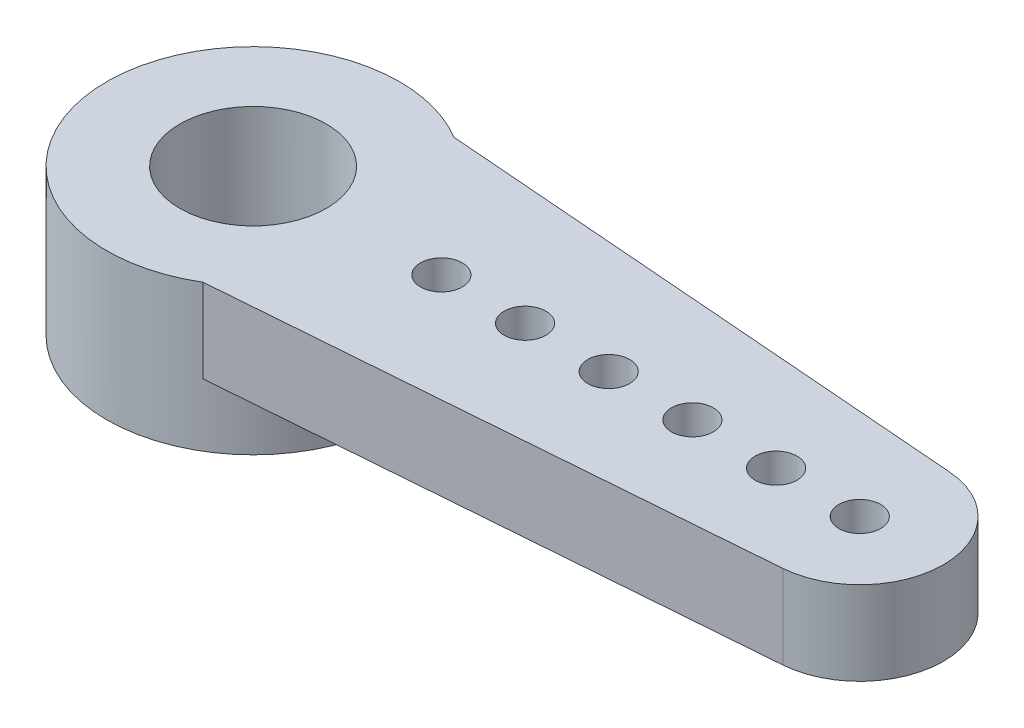
ISO-10303-21;
HEADER;
FILE_DESCRIPTION(('STEP AP214'),'2;1');
FILE_NAME('part.step','',(''),(''),'','','');
FILE_SCHEMA(('AUTOMOTIVE_DESIGN { 1 0 10303 214 1 1 1 1 }'));
ENDSEC;
DATA;
#1=APPLICATION_CONTEXT('core data for automotive mechanical design processes');
#2=APPLICATION_PROTOCOL_DEFINITION('international standard','automotive_design',2000,#1);
#3=PRODUCT_CONTEXT('',#1,'mechanical');
#4=PRODUCT('Part','Part','',(#3));
#5=PRODUCT_RELATED_PRODUCT_CATEGORY('part','',(#4));
#6=PRODUCT_DEFINITION_FORMATION('','',#4);
#7=PRODUCT_DEFINITION_CONTEXT('part definition',#1,'design');
#8=PRODUCT_DEFINITION('design','',#6,#7);
#9=PRODUCT_DEFINITION_SHAPE('','',#8);
#10=(LENGTH_UNIT() NAMED_UNIT(*) SI_UNIT(.MILLI.,.METRE.));
#11=(NAMED_UNIT(*) PLANE_ANGLE_UNIT() SI_UNIT($,.RADIAN.));
#12=(NAMED_UNIT(*) SI_UNIT($,.STERADIAN.) SOLID_ANGLE_UNIT());
#13=UNCERTAINTY_MEASURE_WITH_UNIT(LENGTH_MEASURE(1.E-05),#10,'distance_accuracy_value','');
#14=(GEOMETRIC_REPRESENTATION_CONTEXT(3) GLOBAL_UNCERTAINTY_ASSIGNED_CONTEXT((#13)) GLOBAL_UNIT_ASSIGNED_CONTEXT((#10,
#11,#12)) REPRESENTATION_CONTEXT('',''));
#15=CARTESIAN_POINT('',(0.,0.,0.));
#16=DIRECTION('',(0.,0.,1.));
#17=DIRECTION('',(1.,0.,0.));
#18=AXIS2_PLACEMENT_3D('',#15,#16,#17);
#19=CARTESIAN_POINT('',(0.,0.,0.));
#20=DIRECTION('',(0.,1.,0.));
#21=DIRECTION('',(0.,0.,1.));
#22=AXIS2_PLACEMENT_3D('',#19,#20,#21);
#23=PLANE('',#22);
#24=CARTESIAN_POINT('',(4.5,0.,0.));
#25=DIRECTION('',(0.,1.,0.));
#26=DIRECTION('',(0.,0.,1.));
#27=AXIS2_PLACEMENT_3D('',#24,#25,#26);
#28=CIRCLE('',#27,0.5);
#29=CARTESIAN_POINT('',(4.5,0.,0.5));
#30=VERTEX_POINT('',#29);
#31=EDGE_CURVE('E118',#30,#30,#28,.T.);
#32=ORIENTED_EDGE('',*,*,#31,.T.);
#33=EDGE_LOOP('',(#32));
#34=FACE_BOUND('',#33,.T.);
#35=CARTESIAN_POINT('',(6.5,0.,0.));
#36=DIRECTION('',(0.,1.,0.));
#37=DIRECTION('',(0.,0.,1.));
#38=AXIS2_PLACEMENT_3D('',#35,#36,#37);
#39=CIRCLE('',#38,0.5);
#40=CARTESIAN_POINT('',(6.5,0.,0.5));
#41=VERTEX_POINT('',#40);
#42=EDGE_CURVE('E121',#41,#41,#39,.T.);
#43=ORIENTED_EDGE('',*,*,#42,.T.);
#44=EDGE_LOOP('',(#43));
#45=FACE_BOUND('',#44,.T.);
#46=CARTESIAN_POINT('',(8.5,0.,0.));
#47=DIRECTION('',(0.,1.,0.));
#48=DIRECTION('',(0.,0.,1.));
#49=AXIS2_PLACEMENT_3D('',#46,#47,#48);
#50=CIRCLE('',#49,0.499999999999999);
#51=CARTESIAN_POINT('',(8.5,0.,0.499999999999999));
#52=VERTEX_POINT('',#51);
#53=EDGE_CURVE('E124',#52,#52,#50,.T.);
#54=ORIENTED_EDGE('',*,*,#53,.T.);
#55=EDGE_LOOP('',(#54));
#56=FACE_BOUND('',#55,.T.);
#57=CARTESIAN_POINT('',(10.5,0.,0.));
#58=DIRECTION('',(0.,1.,0.));
#59=DIRECTION('',(0.,0.,1.));
#60=AXIS2_PLACEMENT_3D('',#57,#58,#59);
#61=CIRCLE('',#60,0.500000000000001);
#62=CARTESIAN_POINT('',(10.5,0.,0.500000000000001));
#63=VERTEX_POINT('',#62);
#64=EDGE_CURVE('E127',#63,#63,#61,.T.);
#65=ORIENTED_EDGE('',*,*,#64,.T.);
#66=EDGE_LOOP('',(#65));
#67=FACE_BOUND('',#66,.T.);
#68=CARTESIAN_POINT('',(12.5,0.,0.));
#69=DIRECTION('',(0.,1.,0.));
#70=DIRECTION('',(0.,0.,1.));
#71=AXIS2_PLACEMENT_3D('',#68,#69,#70);
#72=CIRCLE('',#71,0.499999999999999);
#73=CARTESIAN_POINT('',(12.5,0.,0.499999999999999));
#74=VERTEX_POINT('',#73);
#75=EDGE_CURVE('E130',#74,#74,#72,.T.);
#76=ORIENTED_EDGE('',*,*,#75,.T.);
#77=EDGE_LOOP('',(#76));
#78=FACE_BOUND('',#77,.T.);
#79=CARTESIAN_POINT('',(14.5,0.,0.));
#80=DIRECTION('',(0.,1.,0.));
#81=DIRECTION('',(0.,0.,1.));
#82=AXIS2_PLACEMENT_3D('',#79,#80,#81);
#83=CIRCLE('',#82,0.500000000000001);
#84=CARTESIAN_POINT('',(14.5,0.,0.500000000000001));
#85=VERTEX_POINT('',#84);
#86=EDGE_CURVE('E133',#85,#85,#83,.T.);
#87=ORIENTED_EDGE('',*,*,#86,.T.);
#88=EDGE_LOOP('',(#87));
#89=FACE_BOUND('',#88,.T.);
#90=CARTESIAN_POINT('',(0.,0.,0.));
#91=DIRECTION('',(0.,-1.,0.));
#92=DIRECTION('',(0.,0.,-1.));
#93=AXIS2_PLACEMENT_3D('',#90,#91,#92);
#94=CIRCLE('',#93,3.5);
#95=CARTESIAN_POINT('',(1.802775637732,0.,-3.));
#96=VERTEX_POINT('',#95);
#97=CARTESIAN_POINT('',(1.802775637732,0.,3.));
#98=VERTEX_POINT('',#97);
#99=EDGE_CURVE('E84',#96,#98,#94,.T.);
#100=ORIENTED_EDGE('',*,*,#99,.F.);
#101=DIRECTION('',(-0.996950475022503,0.,-0.0780368525275488));
#102=VECTOR('',#101,1.);
#103=CARTESIAN_POINT('',(1.802775637732,0.,-3.));
#104=LINE('',#103,#102);
#105=CARTESIAN_POINT('',(14.6560737050551,0.,-1.993900950045));
#106=VERTEX_POINT('',#105);
#107=EDGE_CURVE('E86',#106,#96,#104,.T.);
#108=ORIENTED_EDGE('',*,*,#107,.F.);
#109=CARTESIAN_POINT('',(14.5,0.,0.));
#110=DIRECTION('',(0.,1.,0.));
#111=DIRECTION('',(0.,0.,1.));
#112=AXIS2_PLACEMENT_3D('',#109,#110,#111);
#113=CIRCLE('',#112,2.);
#114=CARTESIAN_POINT('',(14.6560737050551,0.,1.993900950045));
#115=VERTEX_POINT('',#114);
#116=EDGE_CURVE('E74',#115,#106,#113,.T.);
#117=ORIENTED_EDGE('',*,*,#116,.F.);
#118=DIRECTION('',(0.996950475022503,0.,-0.0780368525275488));
#119=VECTOR('',#118,1.);
#120=CARTESIAN_POINT('',(1.802775637732,0.,3.));
#121=LINE('',#120,#119);
#122=EDGE_CURVE('E67',#98,#115,#121,.T.);
#123=ORIENTED_EDGE('',*,*,#122,.F.);
#124=EDGE_LOOP('',(#100,#108,#117,#123));
#125=FACE_BOUND('',#124,.T.);
#126=ADVANCED_FACE('F35',(#34,#45,#56,#67,#78,#89,#125),#23,.F.);
#127=CARTESIAN_POINT('',(0.,2.,0.));
#128=DIRECTION('',(0.,-1.,0.));
#129=DIRECTION('',(0.,0.,-1.));
#130=AXIS2_PLACEMENT_3D('',#127,#128,#129);
#131=CYLINDRICAL_SURFACE('',#130,3.5);
#132=DIRECTION('',(0.,-1.,0.));
#133=VECTOR('',#132,1.);
#134=CARTESIAN_POINT('',(1.802775637732,2.,-3.));
#135=LINE('',#134,#133);
#136=CARTESIAN_POINT('',(1.802775637732,2.,-3.));
#137=VERTEX_POINT('',#136);
#138=EDGE_CURVE('E94',#137,#96,#135,.T.);
#139=ORIENTED_EDGE('',*,*,#138,.T.);
#140=ORIENTED_EDGE('',*,*,#99,.T.);
#141=DIRECTION('',(0.,-1.,0.));
#142=VECTOR('',#141,1.);
#143=CARTESIAN_POINT('',(1.802775637732,2.,3.));
#144=LINE('',#143,#142);
#145=CARTESIAN_POINT('',(1.802775637732,2.,3.));
#146=VERTEX_POINT('',#145);
#147=EDGE_CURVE('E11',#146,#98,#144,.T.);
#148=ORIENTED_EDGE('',*,*,#147,.F.);
#149=CARTESIAN_POINT('',(0.,2.,0.));
#150=DIRECTION('',(0.,1.,0.));
#151=DIRECTION('',(0.,0.,1.));
#152=AXIS2_PLACEMENT_3D('',#149,#150,#151);
#153=CIRCLE('',#152,3.5);
#154=EDGE_CURVE('E97',#137,#146,#153,.T.);
#155=ORIENTED_EDGE('',*,*,#154,.F.);
#156=EDGE_LOOP('',(#139,#140,#148,#155));
#157=FACE_BOUND('',#156,.T.);
#158=CARTESIAN_POINT('',(0.,-1.5,0.));
#159=DIRECTION('',(0.,-1.,0.));
#160=DIRECTION('',(0.,0.,-1.));
#161=AXIS2_PLACEMENT_3D('',#158,#159,#160);
#162=CIRCLE('',#161,3.5);
#163=CARTESIAN_POINT('',(0.,-1.5,-3.5));
#164=VERTEX_POINT('',#163);
#165=EDGE_CURVE('E90',#164,#164,#162,.T.);
#166=ORIENTED_EDGE('',*,*,#165,.F.);
#167=EDGE_LOOP('',(#166));
#168=FACE_BOUND('',#167,.T.);
#169=ADVANCED_FACE('F37',(#157,#168),#131,.T.);
#170=CARTESIAN_POINT('',(1.802775637732,2.,3.));
#171=DIRECTION('',(-0.0780368525275488,0.,-0.996950475022503));
#172=DIRECTION('',(-0.996950475022503,0.,0.0780368525275488));
#173=AXIS2_PLACEMENT_3D('',#170,#171,#172);
#174=PLANE('',#173);
#175=ORIENTED_EDGE('',*,*,#122,.T.);
#176=DIRECTION('',(0.,-1.,0.));
#177=VECTOR('',#176,1.);
#178=CARTESIAN_POINT('',(14.6560737050551,2.,1.993900950045));
#179=LINE('',#178,#177);
#180=CARTESIAN_POINT('',(14.6560737050551,2.,1.993900950045));
#181=VERTEX_POINT('',#180);
#182=EDGE_CURVE('E45',#181,#115,#179,.T.);
#183=ORIENTED_EDGE('',*,*,#182,.F.);
#184=DIRECTION('',(0.996950475022503,0.,-0.0780368525275488));
#185=VECTOR('',#184,1.);
#186=CARTESIAN_POINT('',(1.802775637732,2.,3.));
#187=LINE('',#186,#185);
#188=EDGE_CURVE('E79',#146,#181,#187,.T.);
#189=ORIENTED_EDGE('',*,*,#188,.F.);
#190=ORIENTED_EDGE('',*,*,#147,.T.);
#191=EDGE_LOOP('',(#175,#183,#189,#190));
#192=FACE_BOUND('',#191,.T.);
#193=ADVANCED_FACE('F174',(#192),#174,.F.);
#194=CARTESIAN_POINT('',(14.5,2.,0.));
#195=DIRECTION('',(0.,-1.,0.));
#196=DIRECTION('',(0.,0.,-1.));
#197=AXIS2_PLACEMENT_3D('',#194,#195,#196);
#198=CYLINDRICAL_SURFACE('',#197,2.);
#199=ORIENTED_EDGE('',*,*,#116,.T.);
#200=DIRECTION('',(0.,-1.,0.));
#201=VECTOR('',#200,1.);
#202=CARTESIAN_POINT('',(14.6560737050551,2.,-1.993900950045));
#203=LINE('',#202,#201);
#204=CARTESIAN_POINT('',(14.6560737050551,2.,-1.993900950045));
#205=VERTEX_POINT('',#204);
#206=EDGE_CURVE('E96',#205,#106,#203,.T.);
#207=ORIENTED_EDGE('',*,*,#206,.F.);
#208=CARTESIAN_POINT('',(14.5,2.,0.));
#209=DIRECTION('',(0.,1.,0.));
#210=DIRECTION('',(0.,0.,1.));
#211=AXIS2_PLACEMENT_3D('',#208,#209,#210);
#212=CIRCLE('',#211,2.);
#213=EDGE_CURVE('E102',#181,#205,#212,.T.);
#214=ORIENTED_EDGE('',*,*,#213,.F.);
#215=ORIENTED_EDGE('',*,*,#182,.T.);
#216=EDGE_LOOP('',(#199,#207,#214,#215));
#217=FACE_BOUND('',#216,.T.);
#218=ADVANCED_FACE('F107',(#217),#198,.T.);
#219=CARTESIAN_POINT('',(1.802775637732,2.,-3.));
#220=DIRECTION('',(-0.0780368525275488,0.,0.996950475022503));
#221=DIRECTION('',(0.996950475022503,0.,0.0780368525275488));
#222=AXIS2_PLACEMENT_3D('',#219,#220,#221);
#223=PLANE('',#222);
#224=ORIENTED_EDGE('',*,*,#107,.T.);
#225=ORIENTED_EDGE('',*,*,#138,.F.);
#226=DIRECTION('',(-0.996950475022503,0.,-0.0780368525275488));
#227=VECTOR('',#226,1.);
#228=CARTESIAN_POINT('',(1.802775637732,2.,-3.));
#229=LINE('',#228,#227);
#230=EDGE_CURVE('E53',#205,#137,#229,.T.);
#231=ORIENTED_EDGE('',*,*,#230,.F.);
#232=ORIENTED_EDGE('',*,*,#206,.T.);
#233=EDGE_LOOP('',(#224,#225,#231,#232));
#234=FACE_BOUND('',#233,.T.);
#235=ADVANCED_FACE('F93',(#234),#223,.F.);
#236=CARTESIAN_POINT('',(0.,2.,0.));
#237=DIRECTION('',(0.,1.,0.));
#238=DIRECTION('',(0.,0.,1.));
#239=AXIS2_PLACEMENT_3D('',#236,#237,#238);
#240=PLANE('',#239);
#241=CARTESIAN_POINT('',(4.5,2.,0.));
#242=DIRECTION('',(0.,1.,0.));
#243=DIRECTION('',(0.,0.,1.));
#244=AXIS2_PLACEMENT_3D('',#241,#242,#243);
#245=CIRCLE('',#244,0.5);
#246=CARTESIAN_POINT('',(4.5,2.,0.5));
#247=VERTEX_POINT('',#246);
#248=EDGE_CURVE('E136',#247,#247,#245,.T.);
#249=ORIENTED_EDGE('',*,*,#248,.F.);
#250=EDGE_LOOP('',(#249));
#251=FACE_BOUND('',#250,.T.);
#252=CARTESIAN_POINT('',(6.5,2.,0.));
#253=DIRECTION('',(0.,1.,0.));
#254=DIRECTION('',(0.,0.,1.));
#255=AXIS2_PLACEMENT_3D('',#252,#253,#254);
#256=CIRCLE('',#255,0.5);
#257=CARTESIAN_POINT('',(6.5,2.,0.5));
#258=VERTEX_POINT('',#257);
#259=EDGE_CURVE('E149',#258,#258,#256,.T.);
#260=ORIENTED_EDGE('',*,*,#259,.F.);
#261=EDGE_LOOP('',(#260));
#262=FACE_BOUND('',#261,.T.);
#263=CARTESIAN_POINT('',(8.5,2.,0.));
#264=DIRECTION('',(0.,1.,0.));
#265=DIRECTION('',(0.,0.,1.));
#266=AXIS2_PLACEMENT_3D('',#263,#264,#265);
#267=CIRCLE('',#266,0.499999999999999);
#268=CARTESIAN_POINT('',(8.5,2.,0.499999999999999));
#269=VERTEX_POINT('',#268);
#270=EDGE_CURVE('E146',#269,#269,#267,.T.);
#271=ORIENTED_EDGE('',*,*,#270,.F.);
#272=EDGE_LOOP('',(#271));
#273=FACE_BOUND('',#272,.T.);
#274=CARTESIAN_POINT('',(10.5,2.,0.));
#275=DIRECTION('',(0.,1.,0.));
#276=DIRECTION('',(0.,0.,1.));
#277=AXIS2_PLACEMENT_3D('',#274,#275,#276);
#278=CIRCLE('',#277,0.500000000000001);
#279=CARTESIAN_POINT('',(10.5,2.,0.500000000000001));
#280=VERTEX_POINT('',#279);
#281=EDGE_CURVE('E143',#280,#280,#278,.T.);
#282=ORIENTED_EDGE('',*,*,#281,.F.);
#283=EDGE_LOOP('',(#282));
#284=FACE_BOUND('',#283,.T.);
#285=CARTESIAN_POINT('',(12.5,2.,0.));
#286=DIRECTION('',(0.,1.,0.));
#287=DIRECTION('',(0.,0.,1.));
#288=AXIS2_PLACEMENT_3D('',#285,#286,#287);
#289=CIRCLE('',#288,0.499999999999999);
#290=CARTESIAN_POINT('',(12.5,2.,0.499999999999999));
#291=VERTEX_POINT('',#290);
#292=EDGE_CURVE('E140',#291,#291,#289,.T.);
#293=ORIENTED_EDGE('',*,*,#292,.F.);
#294=EDGE_LOOP('',(#293));
#295=FACE_BOUND('',#294,.T.);
#296=CARTESIAN_POINT('',(14.5,2.,0.));
#297=DIRECTION('',(0.,1.,0.));
#298=DIRECTION('',(0.,0.,1.));
#299=AXIS2_PLACEMENT_3D('',#296,#297,#298);
#300=CIRCLE('',#299,0.500000000000001);
#301=CARTESIAN_POINT('',(14.5,2.,0.500000000000001));
#302=VERTEX_POINT('',#301);
#303=EDGE_CURVE('E137',#302,#302,#300,.T.);
#304=ORIENTED_EDGE('',*,*,#303,.F.);
#305=EDGE_LOOP('',(#304));
#306=FACE_BOUND('',#305,.T.);
#307=CARTESIAN_POINT('',(0.,2.,0.));
#308=DIRECTION('',(0.,1.,0.));
#309=DIRECTION('',(0.,0.,1.));
#310=AXIS2_PLACEMENT_3D('',#307,#308,#309);
#311=CIRCLE('',#310,1.75);
#312=CARTESIAN_POINT('',(0.,2.,1.75));
#313=VERTEX_POINT('',#312);
#314=EDGE_CURVE('E115',#313,#313,#311,.T.);
#315=ORIENTED_EDGE('',*,*,#314,.F.);
#316=EDGE_LOOP('',(#315));
#317=FACE_BOUND('',#316,.T.);
#318=ORIENTED_EDGE('',*,*,#154,.T.);
#319=ORIENTED_EDGE('',*,*,#188,.T.);
#320=ORIENTED_EDGE('',*,*,#213,.T.);
#321=ORIENTED_EDGE('',*,*,#230,.T.);
#322=EDGE_LOOP('',(#318,#319,#320,#321));
#323=FACE_BOUND('',#322,.T.);
#324=ADVANCED_FACE('F158',(#251,#262,#273,#284,#295,#306,#317,#323),#240,.T.);
#325=CARTESIAN_POINT('',(0.,-1.5,0.));
#326=DIRECTION('',(0.,-1.,0.));
#327=DIRECTION('',(0.,0.,-1.));
#328=AXIS2_PLACEMENT_3D('',#325,#326,#327);
#329=PLANE('',#328);
#330=CARTESIAN_POINT('',(0.,-1.5,0.));
#331=DIRECTION('',(0.,-1.,0.));
#332=DIRECTION('',(0.,0.,-1.));
#333=AXIS2_PLACEMENT_3D('',#330,#331,#332);
#334=CIRCLE('',#333,1.75);
#335=CARTESIAN_POINT('',(0.,-1.5,-1.75));
#336=VERTEX_POINT('',#335);
#337=EDGE_CURVE('E39',#336,#336,#334,.T.);
#338=ORIENTED_EDGE('',*,*,#337,.F.);
#339=EDGE_LOOP('',(#338));
#340=FACE_BOUND('',#339,.T.);
#341=ORIENTED_EDGE('',*,*,#165,.T.);
#342=EDGE_LOOP('',(#341));
#343=FACE_BOUND('',#342,.T.);
#344=ADVANCED_FACE('F161',(#340,#343),#329,.T.);
#345=CARTESIAN_POINT('',(0.,-3.,0.));
#346=DIRECTION('',(0.,1.,0.));
#347=DIRECTION('',(0.,0.,1.));
#348=AXIS2_PLACEMENT_3D('',#345,#346,#347);
#349=CYLINDRICAL_SURFACE('',#348,1.75);
#350=ORIENTED_EDGE('',*,*,#337,.T.);
#351=EDGE_LOOP('',(#350));
#352=FACE_BOUND('',#351,.T.);
#353=ORIENTED_EDGE('',*,*,#314,.T.);
#354=EDGE_LOOP('',(#353));
#355=FACE_BOUND('',#354,.T.);
#356=ADVANCED_FACE('F205',(#352,#355),#349,.F.);
#357=CARTESIAN_POINT('',(14.5,-3.,0.));
#358=DIRECTION('',(0.,1.,0.));
#359=DIRECTION('',(0.,0.,1.));
#360=AXIS2_PLACEMENT_3D('',#357,#358,#359);
#361=CYLINDRICAL_SURFACE('',#360,0.500000000000001);
#362=ORIENTED_EDGE('',*,*,#303,.T.);
#363=EDGE_LOOP('',(#362));
#364=FACE_BOUND('',#363,.T.);
#365=ORIENTED_EDGE('',*,*,#86,.F.);
#366=EDGE_LOOP('',(#365));
#367=FACE_BOUND('',#366,.T.);
#368=ADVANCED_FACE('F212',(#364,#367),#361,.F.);
#369=CARTESIAN_POINT('',(12.5,-3.,0.));
#370=DIRECTION('',(0.,1.,0.));
#371=DIRECTION('',(0.,0.,1.));
#372=AXIS2_PLACEMENT_3D('',#369,#370,#371);
#373=CYLINDRICAL_SURFACE('',#372,0.499999999999999);
#374=ORIENTED_EDGE('',*,*,#292,.T.);
#375=EDGE_LOOP('',(#374));
#376=FACE_BOUND('',#375,.T.);
#377=ORIENTED_EDGE('',*,*,#75,.F.);
#378=EDGE_LOOP('',(#377));
#379=FACE_BOUND('',#378,.T.);
#380=ADVANCED_FACE('F219',(#376,#379),#373,.F.);
#381=CARTESIAN_POINT('',(10.5,-3.,0.));
#382=DIRECTION('',(0.,1.,0.));
#383=DIRECTION('',(0.,0.,1.));
#384=AXIS2_PLACEMENT_3D('',#381,#382,#383);
#385=CYLINDRICAL_SURFACE('',#384,0.500000000000001);
#386=ORIENTED_EDGE('',*,*,#281,.T.);
#387=EDGE_LOOP('',(#386));
#388=FACE_BOUND('',#387,.T.);
#389=ORIENTED_EDGE('',*,*,#64,.F.);
#390=EDGE_LOOP('',(#389));
#391=FACE_BOUND('',#390,.T.);
#392=ADVANCED_FACE('F227',(#388,#391),#385,.F.);
#393=CARTESIAN_POINT('',(8.5,-3.,0.));
#394=DIRECTION('',(0.,1.,0.));
#395=DIRECTION('',(0.,0.,1.));
#396=AXIS2_PLACEMENT_3D('',#393,#394,#395);
#397=CYLINDRICAL_SURFACE('',#396,0.499999999999999);
#398=ORIENTED_EDGE('',*,*,#270,.T.);
#399=EDGE_LOOP('',(#398));
#400=FACE_BOUND('',#399,.T.);
#401=ORIENTED_EDGE('',*,*,#53,.F.);
#402=EDGE_LOOP('',(#401));
#403=FACE_BOUND('',#402,.T.);
#404=ADVANCED_FACE('F235',(#400,#403),#397,.F.);
#405=CARTESIAN_POINT('',(6.5,-3.,0.));
#406=DIRECTION('',(0.,1.,0.));
#407=DIRECTION('',(0.,0.,1.));
#408=AXIS2_PLACEMENT_3D('',#405,#406,#407);
#409=CYLINDRICAL_SURFACE('',#408,0.5);
#410=ORIENTED_EDGE('',*,*,#259,.T.);
#411=EDGE_LOOP('',(#410));
#412=FACE_BOUND('',#411,.T.);
#413=ORIENTED_EDGE('',*,*,#42,.F.);
#414=EDGE_LOOP('',(#413));
#415=FACE_BOUND('',#414,.T.);
#416=ADVANCED_FACE('F243',(#412,#415),#409,.F.);
#417=CARTESIAN_POINT('',(4.5,-3.,0.));
#418=DIRECTION('',(0.,1.,0.));
#419=DIRECTION('',(0.,0.,1.));
#420=AXIS2_PLACEMENT_3D('',#417,#418,#419);
#421=CYLINDRICAL_SURFACE('',#420,0.5);
#422=ORIENTED_EDGE('',*,*,#248,.T.);
#423=EDGE_LOOP('',(#422));
#424=FACE_BOUND('',#423,.T.);
#425=ORIENTED_EDGE('',*,*,#31,.F.);
#426=EDGE_LOOP('',(#425));
#427=FACE_BOUND('',#426,.T.);
#428=ADVANCED_FACE('F155',(#424,#427),#421,.F.);
#429=CLOSED_SHELL('',(#126,#169,#193,#218,#235,#324,#344,#356,#368,#380,#392,#404,#416,#428));
#430=MANIFOLD_SOLID_BREP('B2',#429);
#431=ADVANCED_BREP_SHAPE_REPRESENTATION('',(#18,#430),#14);
#432=SHAPE_DEFINITION_REPRESENTATION(#9,#431);
ENDSEC;
END-ISO-10303-21;
